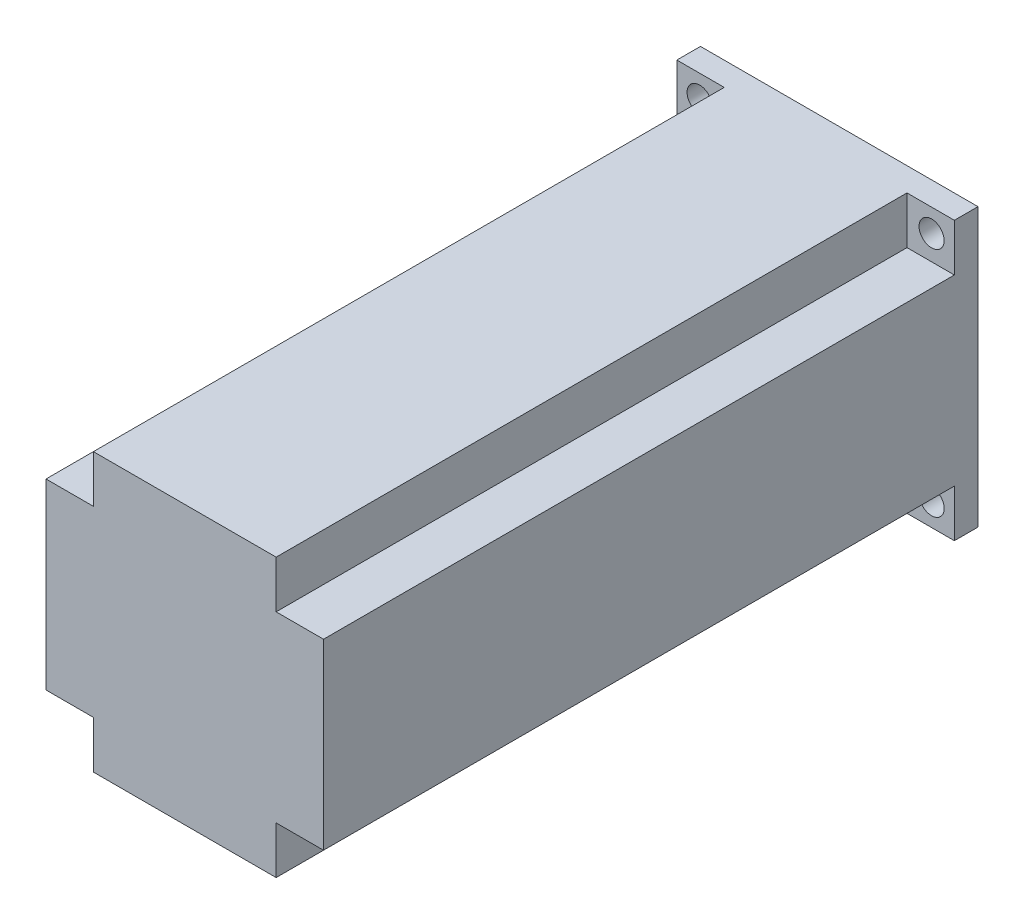
ISO-10303-21;
HEADER;
FILE_DESCRIPTION(('STEP AP214'),'2;1');
FILE_NAME('part.step','',(''),(''),'','','');
FILE_SCHEMA(('AUTOMOTIVE_DESIGN { 1 0 10303 214 1 1 1 1 }'));
ENDSEC;
DATA;
#1=APPLICATION_CONTEXT('core data for automotive mechanical design processes');
#2=APPLICATION_PROTOCOL_DEFINITION('international standard','automotive_design',2000,#1);
#3=PRODUCT_CONTEXT('',#1,'mechanical');
#4=PRODUCT('Part','Part','',(#3));
#5=PRODUCT_RELATED_PRODUCT_CATEGORY('part','',(#4));
#6=PRODUCT_DEFINITION_FORMATION('','',#4);
#7=PRODUCT_DEFINITION_CONTEXT('part definition',#1,'design');
#8=PRODUCT_DEFINITION('design','',#6,#7);
#9=PRODUCT_DEFINITION_SHAPE('','',#8);
#10=(LENGTH_UNIT() NAMED_UNIT(*) SI_UNIT(.MILLI.,.METRE.));
#11=(NAMED_UNIT(*) PLANE_ANGLE_UNIT() SI_UNIT($,.RADIAN.));
#12=(NAMED_UNIT(*) SI_UNIT($,.STERADIAN.) SOLID_ANGLE_UNIT());
#13=UNCERTAINTY_MEASURE_WITH_UNIT(LENGTH_MEASURE(1.E-05),#10,'distance_accuracy_value','');
#14=(GEOMETRIC_REPRESENTATION_CONTEXT(3) GLOBAL_UNCERTAINTY_ASSIGNED_CONTEXT((#13)) GLOBAL_UNIT_ASSIGNED_CONTEXT((#10,
#11,#12)) REPRESENTATION_CONTEXT('',''));
#15=CARTESIAN_POINT('',(0.,0.,0.));
#16=DIRECTION('',(0.,0.,1.));
#17=DIRECTION('',(1.,0.,0.));
#18=AXIS2_PLACEMENT_3D('',#15,#16,#17);
#19=CARTESIAN_POINT('',(0.,0.,133.));
#20=DIRECTION('',(0.,0.,1.));
#21=DIRECTION('',(1.,0.,0.));
#22=AXIS2_PLACEMENT_3D('',#19,#20,#21);
#23=PLANE('',#22);
#24=DIRECTION('',(-1.,0.,0.));
#25=VECTOR('',#24,1.);
#26=CARTESIAN_POINT('',(-28.2,28.2,133.));
#27=LINE('',#26,#25);
#28=CARTESIAN_POINT('',(18.5699999999986,28.2,133.));
#29=VERTEX_POINT('',#28);
#30=CARTESIAN_POINT('',(-18.57,28.2,133.));
#31=VERTEX_POINT('',#30);
#32=EDGE_CURVE('E315',#29,#31,#27,.T.);
#33=ORIENTED_EDGE('',*,*,#32,.T.);
#34=DIRECTION('',(0.,-1.,0.));
#35=VECTOR('',#34,1.);
#36=CARTESIAN_POINT('',(-18.57,28.5699999999986,133.));
#37=LINE('',#36,#35);
#38=CARTESIAN_POINT('',(-18.57,18.5699999999986,133.));
#39=VERTEX_POINT('',#38);
#40=EDGE_CURVE('E247',#31,#39,#37,.T.);
#41=ORIENTED_EDGE('',*,*,#40,.T.);
#42=DIRECTION('',(1.,0.,0.));
#43=VECTOR('',#42,1.);
#44=CARTESIAN_POINT('',(-28.57,18.5699999999986,133.));
#45=LINE('',#44,#43);
#46=CARTESIAN_POINT('',(-28.2,18.5699999999986,133.));
#47=VERTEX_POINT('',#46);
#48=EDGE_CURVE('E218',#47,#39,#45,.T.);
#49=ORIENTED_EDGE('',*,*,#48,.F.);
#50=DIRECTION('',(0.,-1.,0.));
#51=VECTOR('',#50,1.);
#52=CARTESIAN_POINT('',(-28.2,28.2,133.));
#53=LINE('',#52,#51);
#54=CARTESIAN_POINT('',(-28.2,-18.57,133.));
#55=VERTEX_POINT('',#54);
#56=EDGE_CURVE('E319',#47,#55,#53,.T.);
#57=ORIENTED_EDGE('',*,*,#56,.T.);
#58=DIRECTION('',(1.,0.,0.));
#59=VECTOR('',#58,1.);
#60=CARTESIAN_POINT('',(0.,-18.57,133.));
#61=LINE('',#60,#59);
#62=CARTESIAN_POINT('',(-18.5699999999976,-18.57,133.));
#63=VERTEX_POINT('',#62);
#64=EDGE_CURVE('E184',#55,#63,#61,.T.);
#65=ORIENTED_EDGE('',*,*,#64,.T.);
#66=DIRECTION('',(0.,1.,0.));
#67=VECTOR('',#66,1.);
#68=CARTESIAN_POINT('',(-18.5699999999976,0.,133.));
#69=LINE('',#68,#67);
#70=CARTESIAN_POINT('',(-18.5699999999976,-28.2,133.));
#71=VERTEX_POINT('',#70);
#72=EDGE_CURVE('E188',#71,#63,#69,.T.);
#73=ORIENTED_EDGE('',*,*,#72,.F.);
#74=DIRECTION('',(1.,0.,0.));
#75=VECTOR('',#74,1.);
#76=CARTESIAN_POINT('',(-28.2,-28.2,133.));
#77=LINE('',#76,#75);
#78=CARTESIAN_POINT('',(18.570000000001,-28.2,133.));
#79=VERTEX_POINT('',#78);
#80=EDGE_CURVE('E182',#71,#79,#77,.T.);
#81=ORIENTED_EDGE('',*,*,#80,.T.);
#82=DIRECTION('',(0.,1.,0.));
#83=VECTOR('',#82,1.);
#84=CARTESIAN_POINT('',(18.570000000001,0.,133.));
#85=LINE('',#84,#83);
#86=CARTESIAN_POINT('',(18.570000000001,-18.5699999999976,133.));
#87=VERTEX_POINT('',#86);
#88=EDGE_CURVE('E159',#79,#87,#85,.T.);
#89=ORIENTED_EDGE('',*,*,#88,.T.);
#90=DIRECTION('',(-1.,0.,0.));
#91=VECTOR('',#90,1.);
#92=CARTESIAN_POINT('',(0.,-18.5699999999976,133.));
#93=LINE('',#92,#91);
#94=CARTESIAN_POINT('',(28.2,-18.5699999999976,133.));
#95=VERTEX_POINT('',#94);
#96=EDGE_CURVE('E170',#95,#87,#93,.T.);
#97=ORIENTED_EDGE('',*,*,#96,.F.);
#98=DIRECTION('',(0.,1.,0.));
#99=VECTOR('',#98,1.);
#100=CARTESIAN_POINT('',(28.2,28.2,133.));
#101=LINE('',#100,#99);
#102=CARTESIAN_POINT('',(28.2,18.570000000001,133.));
#103=VERTEX_POINT('',#102);
#104=EDGE_CURVE('E312',#95,#103,#101,.T.);
#105=ORIENTED_EDGE('',*,*,#104,.T.);
#106=DIRECTION('',(-1.,0.,0.));
#107=VECTOR('',#106,1.);
#108=CARTESIAN_POINT('',(0.,18.570000000001,133.));
#109=LINE('',#108,#107);
#110=CARTESIAN_POINT('',(18.5699999999986,18.570000000001,133.));
#111=VERTEX_POINT('',#110);
#112=EDGE_CURVE('E167',#103,#111,#109,.T.);
#113=ORIENTED_EDGE('',*,*,#112,.T.);
#114=DIRECTION('',(0.,-1.,0.));
#115=VECTOR('',#114,1.);
#116=CARTESIAN_POINT('',(18.5699999999987,0.,133.));
#117=LINE('',#116,#115);
#118=EDGE_CURVE('E219',#29,#111,#117,.T.);
#119=ORIENTED_EDGE('',*,*,#118,.F.);
#120=EDGE_LOOP('',(#33,#41,#49,#57,#65,#73,#81,#89,#97,#105,#113,#119));
#121=FACE_BOUND('',#120,.T.);
#122=ADVANCED_FACE('F39',(#121),#23,.T.);
#123=CARTESIAN_POINT('',(28.2,28.2,133.));
#124=DIRECTION('',(-1.,0.,0.));
#125=DIRECTION('',(0.,-1.,0.));
#126=AXIS2_PLACEMENT_3D('',#123,#124,#125);
#127=PLANE('',#126);
#128=DIRECTION('',(0.,0.,1.));
#129=VECTOR('',#128,1.);
#130=CARTESIAN_POINT('',(28.2,18.570000000001,4.80000000000003));
#131=LINE('',#130,#129);
#132=CARTESIAN_POINT('',(28.2,18.570000000001,4.80000000000003));
#133=VERTEX_POINT('',#132);
#134=EDGE_CURVE('E207',#133,#103,#131,.T.);
#135=ORIENTED_EDGE('',*,*,#134,.T.);
#136=ORIENTED_EDGE('',*,*,#104,.F.);
#137=DIRECTION('',(0.,0.,1.));
#138=VECTOR('',#137,1.);
#139=CARTESIAN_POINT('',(28.2,-18.5699999999976,4.80000000000003));
#140=LINE('',#139,#138);
#141=CARTESIAN_POINT('',(28.2,-18.5699999999976,4.80000000000003));
#142=VERTEX_POINT('',#141);
#143=EDGE_CURVE('E166',#142,#95,#140,.T.);
#144=ORIENTED_EDGE('',*,*,#143,.F.);
#145=DIRECTION('',(0.,1.,0.));
#146=VECTOR('',#145,1.);
#147=CARTESIAN_POINT('',(28.2,0.,4.80000000000003));
#148=LINE('',#147,#146);
#149=CARTESIAN_POINT('',(28.2,-28.2,4.80000000000003));
#150=VERTEX_POINT('',#149);
#151=EDGE_CURVE('E199',#150,#142,#148,.T.);
#152=ORIENTED_EDGE('',*,*,#151,.F.);
#153=DIRECTION('',(0.,0.,-1.));
#154=VECTOR('',#153,1.);
#155=CARTESIAN_POINT('',(28.2,-28.2,133.));
#156=LINE('',#155,#154);
#157=CARTESIAN_POINT('',(28.2,-28.2,0.));
#158=VERTEX_POINT('',#157);
#159=EDGE_CURVE('E325',#150,#158,#156,.T.);
#160=ORIENTED_EDGE('',*,*,#159,.T.);
#161=DIRECTION('',(0.,1.,0.));
#162=VECTOR('',#161,1.);
#163=CARTESIAN_POINT('',(28.2,28.2,0.));
#164=LINE('',#163,#162);
#165=CARTESIAN_POINT('',(28.2,28.2,0.));
#166=VERTEX_POINT('',#165);
#167=EDGE_CURVE('E311',#158,#166,#164,.T.);
#168=ORIENTED_EDGE('',*,*,#167,.T.);
#169=DIRECTION('',(0.,0.,-1.));
#170=VECTOR('',#169,1.);
#171=CARTESIAN_POINT('',(28.2,28.2,133.));
#172=LINE('',#171,#170);
#173=CARTESIAN_POINT('',(28.2,28.2,4.80000000000003));
#174=VERTEX_POINT('',#173);
#175=EDGE_CURVE('E348',#174,#166,#172,.T.);
#176=ORIENTED_EDGE('',*,*,#175,.F.);
#177=DIRECTION('',(0.,1.,0.));
#178=VECTOR('',#177,1.);
#179=CARTESIAN_POINT('',(28.2,0.,4.80000000000003));
#180=LINE('',#179,#178);
#181=EDGE_CURVE('E55',#133,#174,#180,.T.);
#182=ORIENTED_EDGE('',*,*,#181,.F.);
#183=EDGE_LOOP('',(#135,#136,#144,#152,#160,#168,#176,#182));
#184=FACE_BOUND('',#183,.T.);
#185=ADVANCED_FACE('F41',(#184),#127,.F.);
#186=CARTESIAN_POINT('',(-28.2,28.2,133.));
#187=DIRECTION('',(0.,-1.,0.));
#188=DIRECTION('',(0.,0.,-1.));
#189=AXIS2_PLACEMENT_3D('',#186,#187,#188);
#190=PLANE('',#189);
#191=DIRECTION('',(0.,0.,-1.));
#192=VECTOR('',#191,1.);
#193=CARTESIAN_POINT('',(-18.57,28.2,133.));
#194=LINE('',#193,#192);
#195=CARTESIAN_POINT('',(-18.57,28.2,4.80000000000003));
#196=VERTEX_POINT('',#195);
#197=EDGE_CURVE('E48',#31,#196,#194,.T.);
#198=ORIENTED_EDGE('',*,*,#197,.F.);
#199=ORIENTED_EDGE('',*,*,#32,.F.);
#200=DIRECTION('',(0.,0.,1.));
#201=VECTOR('',#200,1.);
#202=CARTESIAN_POINT('',(18.5699999999986,28.2,4.80000000000003));
#203=LINE('',#202,#201);
#204=CARTESIAN_POINT('',(18.5699999999986,28.2,4.80000000000003));
#205=VERTEX_POINT('',#204);
#206=EDGE_CURVE('E212',#205,#29,#203,.T.);
#207=ORIENTED_EDGE('',*,*,#206,.F.);
#208=DIRECTION('',(-1.,0.,0.));
#209=VECTOR('',#208,1.);
#210=CARTESIAN_POINT('',(0.,28.2,4.80000000000003));
#211=LINE('',#210,#209);
#212=EDGE_CURVE('E234',#174,#205,#211,.T.);
#213=ORIENTED_EDGE('',*,*,#212,.F.);
#214=ORIENTED_EDGE('',*,*,#175,.T.);
#215=DIRECTION('',(-1.,0.,0.));
#216=VECTOR('',#215,1.);
#217=CARTESIAN_POINT('',(-28.2,28.2,0.));
#218=LINE('',#217,#216);
#219=CARTESIAN_POINT('',(-28.2,28.2,0.));
#220=VERTEX_POINT('',#219);
#221=EDGE_CURVE('E329',#166,#220,#218,.T.);
#222=ORIENTED_EDGE('',*,*,#221,.T.);
#223=DIRECTION('',(0.,0.,-1.));
#224=VECTOR('',#223,1.);
#225=CARTESIAN_POINT('',(-28.2,28.2,133.));
#226=LINE('',#225,#224);
#227=CARTESIAN_POINT('',(-28.2,28.2,4.80000000000003));
#228=VERTEX_POINT('',#227);
#229=EDGE_CURVE('E345',#228,#220,#226,.T.);
#230=ORIENTED_EDGE('',*,*,#229,.F.);
#231=DIRECTION('',(-1.,0.,0.));
#232=VECTOR('',#231,1.);
#233=CARTESIAN_POINT('',(-28.2,28.2,4.80000000000003));
#234=LINE('',#233,#232);
#235=EDGE_CURVE('E63',#196,#228,#234,.T.);
#236=ORIENTED_EDGE('',*,*,#235,.F.);
#237=EDGE_LOOP('',(#198,#199,#207,#213,#214,#222,#230,#236));
#238=FACE_BOUND('',#237,.T.);
#239=ADVANCED_FACE('F398',(#238),#190,.F.);
#240=CARTESIAN_POINT('',(-28.2,28.2,133.));
#241=DIRECTION('',(1.,0.,0.));
#242=DIRECTION('',(0.,1.,0.));
#243=AXIS2_PLACEMENT_3D('',#240,#241,#242);
#244=PLANE('',#243);
#245=ORIENTED_EDGE('',*,*,#56,.F.);
#246=DIRECTION('',(0.,0.,-1.));
#247=VECTOR('',#246,1.);
#248=CARTESIAN_POINT('',(-28.2,18.5699999999986,133.));
#249=LINE('',#248,#247);
#250=CARTESIAN_POINT('',(-28.2,18.5699999999986,4.80000000000003));
#251=VERTEX_POINT('',#250);
#252=EDGE_CURVE('E351',#47,#251,#249,.T.);
#253=ORIENTED_EDGE('',*,*,#252,.T.);
#254=DIRECTION('',(0.,-1.,0.));
#255=VECTOR('',#254,1.);
#256=CARTESIAN_POINT('',(-28.2,28.2,4.80000000000003));
#257=LINE('',#256,#255);
#258=EDGE_CURVE('E290',#228,#251,#257,.T.);
#259=ORIENTED_EDGE('',*,*,#258,.F.);
#260=ORIENTED_EDGE('',*,*,#229,.T.);
#261=DIRECTION('',(0.,-1.,0.));
#262=VECTOR('',#261,1.);
#263=CARTESIAN_POINT('',(-28.2,28.2,0.));
#264=LINE('',#263,#262);
#265=CARTESIAN_POINT('',(-28.2,-28.2,0.));
#266=VERTEX_POINT('',#265);
#267=EDGE_CURVE('E333',#220,#266,#264,.T.);
#268=ORIENTED_EDGE('',*,*,#267,.T.);
#269=DIRECTION('',(0.,0.,-1.));
#270=VECTOR('',#269,1.);
#271=CARTESIAN_POINT('',(-28.2,-28.2,133.));
#272=LINE('',#271,#270);
#273=CARTESIAN_POINT('',(-28.2,-28.2,4.80000000000003));
#274=VERTEX_POINT('',#273);
#275=EDGE_CURVE('E342',#274,#266,#272,.T.);
#276=ORIENTED_EDGE('',*,*,#275,.F.);
#277=DIRECTION('',(0.,-1.,0.));
#278=VECTOR('',#277,1.);
#279=CARTESIAN_POINT('',(-28.2,0.,4.80000000000003));
#280=LINE('',#279,#278);
#281=CARTESIAN_POINT('',(-28.2,-18.57,4.80000000000003));
#282=VERTEX_POINT('',#281);
#283=EDGE_CURVE('E262',#282,#274,#280,.T.);
#284=ORIENTED_EDGE('',*,*,#283,.F.);
#285=DIRECTION('',(0.,0.,1.));
#286=VECTOR('',#285,1.);
#287=CARTESIAN_POINT('',(-28.2,-18.57,4.80000000000003));
#288=LINE('',#287,#286);
#289=EDGE_CURVE('E275',#282,#55,#288,.T.);
#290=ORIENTED_EDGE('',*,*,#289,.T.);
#291=EDGE_LOOP('',(#245,#253,#259,#260,#268,#276,#284,#290));
#292=FACE_BOUND('',#291,.T.);
#293=ADVANCED_FACE('F409',(#292),#244,.F.);
#294=CARTESIAN_POINT('',(-28.2,-28.2,133.));
#295=DIRECTION('',(0.,1.,0.));
#296=DIRECTION('',(0.,0.,1.));
#297=AXIS2_PLACEMENT_3D('',#294,#295,#296);
#298=PLANE('',#297);
#299=DIRECTION('',(0.,0.,1.));
#300=VECTOR('',#299,1.);
#301=CARTESIAN_POINT('',(18.570000000001,-28.2,4.80000000000003));
#302=LINE('',#301,#300);
#303=CARTESIAN_POINT('',(18.570000000001,-28.2,4.80000000000003));
#304=VERTEX_POINT('',#303);
#305=EDGE_CURVE('E196',#304,#79,#302,.T.);
#306=ORIENTED_EDGE('',*,*,#305,.T.);
#307=ORIENTED_EDGE('',*,*,#80,.F.);
#308=DIRECTION('',(0.,0.,1.));
#309=VECTOR('',#308,1.);
#310=CARTESIAN_POINT('',(-18.5699999999976,-28.2,4.80000000000003));
#311=LINE('',#310,#309);
#312=CARTESIAN_POINT('',(-18.5699999999976,-28.2,4.80000000000003));
#313=VERTEX_POINT('',#312);
#314=EDGE_CURVE('E284',#313,#71,#311,.T.);
#315=ORIENTED_EDGE('',*,*,#314,.F.);
#316=DIRECTION('',(1.,0.,0.));
#317=VECTOR('',#316,1.);
#318=CARTESIAN_POINT('',(0.,-28.2,4.80000000000003));
#319=LINE('',#318,#317);
#320=EDGE_CURVE('E265',#274,#313,#319,.T.);
#321=ORIENTED_EDGE('',*,*,#320,.F.);
#322=ORIENTED_EDGE('',*,*,#275,.T.);
#323=DIRECTION('',(1.,0.,0.));
#324=VECTOR('',#323,1.);
#325=CARTESIAN_POINT('',(-28.2,-28.2,0.));
#326=LINE('',#325,#324);
#327=EDGE_CURVE('E316',#266,#158,#326,.T.);
#328=ORIENTED_EDGE('',*,*,#327,.T.);
#329=ORIENTED_EDGE('',*,*,#159,.F.);
#330=DIRECTION('',(1.,0.,0.));
#331=VECTOR('',#330,1.);
#332=CARTESIAN_POINT('',(0.,-28.2,4.80000000000003));
#333=LINE('',#332,#331);
#334=EDGE_CURVE('E202',#304,#150,#333,.T.);
#335=ORIENTED_EDGE('',*,*,#334,.F.);
#336=EDGE_LOOP('',(#306,#307,#315,#321,#322,#328,#329,#335));
#337=FACE_BOUND('',#336,.T.);
#338=ADVANCED_FACE('F379',(#337),#298,.F.);
#339=CARTESIAN_POINT('',(23.57,23.57,133.));
#340=DIRECTION('',(0.,0.,-1.));
#341=DIRECTION('',(-1.,0.,0.));
#342=AXIS2_PLACEMENT_3D('',#339,#340,#341);
#343=CYLINDRICAL_SURFACE('',#342,2.55);
#344=CARTESIAN_POINT('',(23.57,23.57,0.));
#345=DIRECTION('',(0.,0.,1.));
#346=DIRECTION('',(1.,0.,0.));
#347=AXIS2_PLACEMENT_3D('',#344,#345,#346);
#348=CIRCLE('',#347,2.55);
#349=CARTESIAN_POINT('',(26.12,23.57,0.));
#350=VERTEX_POINT('',#349);
#351=EDGE_CURVE('E307',#350,#350,#348,.T.);
#352=ORIENTED_EDGE('',*,*,#351,.F.);
#353=EDGE_LOOP('',(#352));
#354=FACE_BOUND('',#353,.T.);
#355=CARTESIAN_POINT('',(23.57,23.57,4.80000000000003));
#356=DIRECTION('',(0.,0.,1.));
#357=DIRECTION('',(1.,0.,0.));
#358=AXIS2_PLACEMENT_3D('',#355,#356,#357);
#359=CIRCLE('',#358,2.55);
#360=CARTESIAN_POINT('',(26.12,23.57,4.80000000000003));
#361=VERTEX_POINT('',#360);
#362=EDGE_CURVE('E211',#361,#361,#359,.F.);
#363=ORIENTED_EDGE('',*,*,#362,.F.);
#364=EDGE_LOOP('',(#363));
#365=FACE_BOUND('',#364,.T.);
#366=ADVANCED_FACE('F464',(#354,#365),#343,.F.);
#367=CARTESIAN_POINT('',(23.5700000000014,-23.57,133.));
#368=DIRECTION('',(0.,0.,-1.));
#369=DIRECTION('',(-1.,0.,0.));
#370=AXIS2_PLACEMENT_3D('',#367,#368,#369);
#371=CYLINDRICAL_SURFACE('',#370,2.54999999999967);
#372=CARTESIAN_POINT('',(23.5700000000014,-23.57,0.));
#373=DIRECTION('',(0.,0.,1.));
#374=DIRECTION('',(1.,0.,0.));
#375=AXIS2_PLACEMENT_3D('',#372,#373,#374);
#376=CIRCLE('',#375,2.54999999999967);
#377=CARTESIAN_POINT('',(26.120000000001,-23.57,0.));
#378=VERTEX_POINT('',#377);
#379=EDGE_CURVE('E303',#378,#378,#376,.T.);
#380=ORIENTED_EDGE('',*,*,#379,.F.);
#381=EDGE_LOOP('',(#380));
#382=FACE_BOUND('',#381,.T.);
#383=CARTESIAN_POINT('',(23.5700000000014,-23.57,4.80000000000003));
#384=DIRECTION('',(0.,0.,1.));
#385=DIRECTION('',(1.,0.,0.));
#386=AXIS2_PLACEMENT_3D('',#383,#384,#385);
#387=CIRCLE('',#386,2.54999999999967);
#388=CARTESIAN_POINT('',(26.120000000001,-23.57,4.80000000000003));
#389=VERTEX_POINT('',#388);
#390=EDGE_CURVE('E191',#389,#389,#387,.F.);
#391=ORIENTED_EDGE('',*,*,#390,.F.);
#392=EDGE_LOOP('',(#391));
#393=FACE_BOUND('',#392,.T.);
#394=ADVANCED_FACE('F489',(#382,#393),#371,.F.);
#395=CARTESIAN_POINT('',(-23.5699999999986,-23.5700000000013,133.));
#396=DIRECTION('',(0.,0.,-1.));
#397=DIRECTION('',(-1.,0.,0.));
#398=AXIS2_PLACEMENT_3D('',#395,#396,#397);
#399=CYLINDRICAL_SURFACE('',#398,2.55000000000102);
#400=CARTESIAN_POINT('',(-23.5699999999986,-23.5700000000013,0.));
#401=DIRECTION('',(0.,0.,1.));
#402=DIRECTION('',(1.,0.,0.));
#403=AXIS2_PLACEMENT_3D('',#400,#401,#402);
#404=CIRCLE('',#403,2.55000000000102);
#405=CARTESIAN_POINT('',(-21.0199999999976,-23.5700000000013,0.));
#406=VERTEX_POINT('',#405);
#407=EDGE_CURVE('E299',#406,#406,#404,.T.);
#408=ORIENTED_EDGE('',*,*,#407,.F.);
#409=EDGE_LOOP('',(#408));
#410=FACE_BOUND('',#409,.T.);
#411=CARTESIAN_POINT('',(-23.5699999999986,-23.5700000000013,4.80000000000003));
#412=DIRECTION('',(0.,0.,1.));
#413=DIRECTION('',(1.,0.,0.));
#414=AXIS2_PLACEMENT_3D('',#411,#412,#413);
#415=CIRCLE('',#414,2.55000000000102);
#416=CARTESIAN_POINT('',(-21.0199999999976,-23.5700000000013,4.80000000000003));
#417=VERTEX_POINT('',#416);
#418=EDGE_CURVE('E272',#417,#417,#415,.F.);
#419=ORIENTED_EDGE('',*,*,#418,.F.);
#420=EDGE_LOOP('',(#419));
#421=FACE_BOUND('',#420,.T.);
#422=ADVANCED_FACE('F443',(#410,#421),#399,.F.);
#423=CARTESIAN_POINT('',(-23.57,23.5699999999986,133.));
#424=DIRECTION('',(0.,0.,-1.));
#425=DIRECTION('',(-1.,0.,0.));
#426=AXIS2_PLACEMENT_3D('',#423,#424,#425);
#427=CYLINDRICAL_SURFACE('',#426,2.55000000000145);
#428=CARTESIAN_POINT('',(-23.57,23.5699999999986,0.));
#429=DIRECTION('',(0.,0.,1.));
#430=DIRECTION('',(1.,0.,0.));
#431=AXIS2_PLACEMENT_3D('',#428,#429,#430);
#432=CIRCLE('',#431,2.55000000000145);
#433=CARTESIAN_POINT('',(-21.0199999999986,23.5699999999986,0.));
#434=VERTEX_POINT('',#433);
#435=EDGE_CURVE('E295',#434,#434,#432,.T.);
#436=ORIENTED_EDGE('',*,*,#435,.F.);
#437=EDGE_LOOP('',(#436));
#438=FACE_BOUND('',#437,.T.);
#439=CARTESIAN_POINT('',(-23.57,23.5699999999986,4.80000000000003));
#440=DIRECTION('',(0.,0.,1.));
#441=DIRECTION('',(1.,0.,0.));
#442=AXIS2_PLACEMENT_3D('',#439,#440,#441);
#443=CIRCLE('',#442,2.55000000000145);
#444=CARTESIAN_POINT('',(-21.0199999999986,23.5699999999986,4.80000000000003));
#445=VERTEX_POINT('',#444);
#446=EDGE_CURVE('E283',#445,#445,#443,.T.);
#447=ORIENTED_EDGE('',*,*,#446,.T.);
#448=EDGE_LOOP('',(#447));
#449=FACE_BOUND('',#448,.T.);
#450=ADVANCED_FACE('F430',(#438,#449),#427,.F.);
#451=CARTESIAN_POINT('',(0.,0.,0.));
#452=DIRECTION('',(0.,0.,1.));
#453=DIRECTION('',(1.,0.,0.));
#454=AXIS2_PLACEMENT_3D('',#451,#452,#453);
#455=PLANE('',#454);
#456=CARTESIAN_POINT('',(0.,0.,0.));
#457=DIRECTION('',(0.,0.,1.));
#458=DIRECTION('',(1.,0.,0.));
#459=AXIS2_PLACEMENT_3D('',#456,#457,#458);
#460=CIRCLE('',#459,19.05);
#461=CARTESIAN_POINT('',(19.05,0.,0.));
#462=VERTEX_POINT('',#461);
#463=EDGE_CURVE('E11',#462,#462,#460,.F.);
#464=ORIENTED_EDGE('',*,*,#463,.F.);
#465=EDGE_LOOP('',(#464));
#466=FACE_BOUND('',#465,.T.);
#467=ORIENTED_EDGE('',*,*,#167,.F.);
#468=ORIENTED_EDGE('',*,*,#327,.F.);
#469=ORIENTED_EDGE('',*,*,#267,.F.);
#470=ORIENTED_EDGE('',*,*,#221,.F.);
#471=EDGE_LOOP('',(#467,#468,#469,#470));
#472=FACE_BOUND('',#471,.T.);
#473=ORIENTED_EDGE('',*,*,#351,.T.);
#474=EDGE_LOOP('',(#473));
#475=FACE_BOUND('',#474,.T.);
#476=ORIENTED_EDGE('',*,*,#379,.T.);
#477=EDGE_LOOP('',(#476));
#478=FACE_BOUND('',#477,.T.);
#479=ORIENTED_EDGE('',*,*,#407,.T.);
#480=EDGE_LOOP('',(#479));
#481=FACE_BOUND('',#480,.T.);
#482=ORIENTED_EDGE('',*,*,#435,.T.);
#483=EDGE_LOOP('',(#482));
#484=FACE_BOUND('',#483,.T.);
#485=ADVANCED_FACE('F427',(#466,#472,#475,#478,#481,#484),#455,.F.);
#486=CARTESIAN_POINT('',(-18.57,28.5699999999986,4.80000000000003));
#487=DIRECTION('',(-1.,0.,0.));
#488=DIRECTION('',(0.,0.,1.));
#489=AXIS2_PLACEMENT_3D('',#486,#487,#488);
#490=PLANE('',#489);
#491=ORIENTED_EDGE('',*,*,#197,.T.);
#492=DIRECTION('',(0.,-1.,0.));
#493=VECTOR('',#492,1.);
#494=CARTESIAN_POINT('',(-18.57,28.5699999999986,4.80000000000003));
#495=LINE('',#494,#493);
#496=CARTESIAN_POINT('',(-18.57,18.5699999999986,4.80000000000003));
#497=VERTEX_POINT('',#496);
#498=EDGE_CURVE('E245',#196,#497,#495,.T.);
#499=ORIENTED_EDGE('',*,*,#498,.T.);
#500=DIRECTION('',(0.,0.,1.));
#501=VECTOR('',#500,1.);
#502=CARTESIAN_POINT('',(-18.57,18.5699999999986,4.80000000000003));
#503=LINE('',#502,#501);
#504=EDGE_CURVE('E241',#497,#39,#503,.T.);
#505=ORIENTED_EDGE('',*,*,#504,.T.);
#506=ORIENTED_EDGE('',*,*,#40,.F.);
#507=EDGE_LOOP('',(#491,#499,#505,#506));
#508=FACE_BOUND('',#507,.T.);
#509=ADVANCED_FACE('F403',(#508),#490,.T.);
#510=CARTESIAN_POINT('',(-28.57,18.5699999999986,4.80000000000003));
#511=DIRECTION('',(0.,-1.,0.));
#512=DIRECTION('',(0.,0.,-1.));
#513=AXIS2_PLACEMENT_3D('',#510,#511,#512);
#514=PLANE('',#513);
#515=ORIENTED_EDGE('',*,*,#48,.T.);
#516=ORIENTED_EDGE('',*,*,#504,.F.);
#517=DIRECTION('',(1.,0.,0.));
#518=VECTOR('',#517,1.);
#519=CARTESIAN_POINT('',(-28.57,18.5699999999986,4.80000000000003));
#520=LINE('',#519,#518);
#521=EDGE_CURVE('E251',#251,#497,#520,.T.);
#522=ORIENTED_EDGE('',*,*,#521,.F.);
#523=ORIENTED_EDGE('',*,*,#252,.F.);
#524=EDGE_LOOP('',(#515,#516,#522,#523));
#525=FACE_BOUND('',#524,.T.);
#526=ADVANCED_FACE('F407',(#525),#514,.F.);
#527=CARTESIAN_POINT('',(0.,0.,4.80000000000003));
#528=DIRECTION('',(0.,0.,1.));
#529=DIRECTION('',(1.,0.,0.));
#530=AXIS2_PLACEMENT_3D('',#527,#528,#529);
#531=PLANE('',#530);
#532=ORIENTED_EDGE('',*,*,#446,.F.);
#533=EDGE_LOOP('',(#532));
#534=FACE_BOUND('',#533,.T.);
#535=ORIENTED_EDGE('',*,*,#235,.T.);
#536=ORIENTED_EDGE('',*,*,#258,.T.);
#537=ORIENTED_EDGE('',*,*,#521,.T.);
#538=ORIENTED_EDGE('',*,*,#498,.F.);
#539=EDGE_LOOP('',(#535,#536,#537,#538));
#540=FACE_BOUND('',#539,.T.);
#541=ADVANCED_FACE('F447',(#534,#540),#531,.T.);
#542=CARTESIAN_POINT('',(0.,-18.57,4.80000000000003));
#543=DIRECTION('',(0.,-1.,0.));
#544=DIRECTION('',(1.,0.,0.));
#545=AXIS2_PLACEMENT_3D('',#542,#543,#544);
#546=PLANE('',#545);
#547=ORIENTED_EDGE('',*,*,#64,.F.);
#548=ORIENTED_EDGE('',*,*,#289,.F.);
#549=DIRECTION('',(1.,0.,0.));
#550=VECTOR('',#549,1.);
#551=CARTESIAN_POINT('',(0.,-18.57,4.80000000000003));
#552=LINE('',#551,#550);
#553=CARTESIAN_POINT('',(-18.5699999999976,-18.57,4.80000000000003));
#554=VERTEX_POINT('',#553);
#555=EDGE_CURVE('E259',#282,#554,#552,.T.);
#556=ORIENTED_EDGE('',*,*,#555,.T.);
#557=DIRECTION('',(0.,0.,1.));
#558=VECTOR('',#557,1.);
#559=CARTESIAN_POINT('',(-18.5699999999976,-18.57,4.80000000000003));
#560=LINE('',#559,#558);
#561=EDGE_CURVE('E280',#554,#63,#560,.T.);
#562=ORIENTED_EDGE('',*,*,#561,.T.);
#563=EDGE_LOOP('',(#547,#548,#556,#562));
#564=FACE_BOUND('',#563,.T.);
#565=ADVANCED_FACE('F413',(#564),#546,.T.);
#566=CARTESIAN_POINT('',(-18.5699999999976,0.,4.80000000000003));
#567=DIRECTION('',(1.,0.,0.));
#568=DIRECTION('',(0.,1.,0.));
#569=AXIS2_PLACEMENT_3D('',#566,#567,#568);
#570=PLANE('',#569);
#571=ORIENTED_EDGE('',*,*,#72,.T.);
#572=ORIENTED_EDGE('',*,*,#561,.F.);
#573=DIRECTION('',(0.,1.,0.));
#574=VECTOR('',#573,1.);
#575=CARTESIAN_POINT('',(-18.5699999999976,0.,4.80000000000003));
#576=LINE('',#575,#574);
#577=EDGE_CURVE('E268',#313,#554,#576,.T.);
#578=ORIENTED_EDGE('',*,*,#577,.F.);
#579=ORIENTED_EDGE('',*,*,#314,.T.);
#580=EDGE_LOOP('',(#571,#572,#578,#579));
#581=FACE_BOUND('',#580,.T.);
#582=ADVANCED_FACE('F418',(#581),#570,.F.);
#583=CARTESIAN_POINT('',(0.,0.,4.80000000000003));
#584=DIRECTION('',(0.,0.,1.));
#585=DIRECTION('',(1.,0.,0.));
#586=AXIS2_PLACEMENT_3D('',#583,#584,#585);
#587=PLANE('',#586);
#588=ORIENTED_EDGE('',*,*,#555,.F.);
#589=ORIENTED_EDGE('',*,*,#283,.T.);
#590=ORIENTED_EDGE('',*,*,#320,.T.);
#591=ORIENTED_EDGE('',*,*,#577,.T.);
#592=EDGE_LOOP('',(#588,#589,#590,#591));
#593=FACE_BOUND('',#592,.T.);
#594=ORIENTED_EDGE('',*,*,#418,.T.);
#595=EDGE_LOOP('',(#594));
#596=FACE_BOUND('',#595,.T.);
#597=ADVANCED_FACE('F541',(#593,#596),#587,.T.);
#598=CARTESIAN_POINT('',(18.570000000001,0.,4.80000000000003));
#599=DIRECTION('',(1.,0.,0.));
#600=DIRECTION('',(0.,0.,-1.));
#601=AXIS2_PLACEMENT_3D('',#598,#599,#600);
#602=PLANE('',#601);
#603=ORIENTED_EDGE('',*,*,#88,.F.);
#604=ORIENTED_EDGE('',*,*,#305,.F.);
#605=DIRECTION('',(0.,1.,0.));
#606=VECTOR('',#605,1.);
#607=CARTESIAN_POINT('',(18.570000000001,0.,4.80000000000003));
#608=LINE('',#607,#606);
#609=CARTESIAN_POINT('',(18.570000000001,-18.5699999999976,4.80000000000003));
#610=VERTEX_POINT('',#609);
#611=EDGE_CURVE('E161',#304,#610,#608,.T.);
#612=ORIENTED_EDGE('',*,*,#611,.T.);
#613=DIRECTION('',(0.,0.,1.));
#614=VECTOR('',#613,1.);
#615=CARTESIAN_POINT('',(18.570000000001,-18.5699999999976,4.80000000000003));
#616=LINE('',#615,#614);
#617=EDGE_CURVE('E154',#610,#87,#616,.T.);
#618=ORIENTED_EDGE('',*,*,#617,.T.);
#619=EDGE_LOOP('',(#603,#604,#612,#618));
#620=FACE_BOUND('',#619,.T.);
#621=ADVANCED_FACE('F156',(#620),#602,.T.);
#622=CARTESIAN_POINT('',(0.,-18.5699999999976,4.80000000000003));
#623=DIRECTION('',(0.,1.,0.));
#624=DIRECTION('',(0.,0.,1.));
#625=AXIS2_PLACEMENT_3D('',#622,#623,#624);
#626=PLANE('',#625);
#627=ORIENTED_EDGE('',*,*,#96,.T.);
#628=ORIENTED_EDGE('',*,*,#617,.F.);
#629=DIRECTION('',(-1.,0.,0.));
#630=VECTOR('',#629,1.);
#631=CARTESIAN_POINT('',(0.,-18.5699999999976,4.80000000000003));
#632=LINE('',#631,#630);
#633=EDGE_CURVE('E195',#142,#610,#632,.T.);
#634=ORIENTED_EDGE('',*,*,#633,.F.);
#635=ORIENTED_EDGE('',*,*,#143,.T.);
#636=EDGE_LOOP('',(#627,#628,#634,#635));
#637=FACE_BOUND('',#636,.T.);
#638=ADVANCED_FACE('F171',(#637),#626,.F.);
#639=CARTESIAN_POINT('',(0.,0.,4.80000000000003));
#640=DIRECTION('',(0.,0.,1.));
#641=DIRECTION('',(1.,0.,0.));
#642=AXIS2_PLACEMENT_3D('',#639,#640,#641);
#643=PLANE('',#642);
#644=ORIENTED_EDGE('',*,*,#611,.F.);
#645=ORIENTED_EDGE('',*,*,#334,.T.);
#646=ORIENTED_EDGE('',*,*,#151,.T.);
#647=ORIENTED_EDGE('',*,*,#633,.T.);
#648=EDGE_LOOP('',(#644,#645,#646,#647));
#649=FACE_BOUND('',#648,.T.);
#650=ORIENTED_EDGE('',*,*,#390,.T.);
#651=EDGE_LOOP('',(#650));
#652=FACE_BOUND('',#651,.T.);
#653=ADVANCED_FACE('F384',(#649,#652),#643,.T.);
#654=CARTESIAN_POINT('',(0.,18.570000000001,4.80000000000003));
#655=DIRECTION('',(0.,1.,0.));
#656=DIRECTION('',(-1.,0.,0.));
#657=AXIS2_PLACEMENT_3D('',#654,#655,#656);
#658=PLANE('',#657);
#659=ORIENTED_EDGE('',*,*,#112,.F.);
#660=ORIENTED_EDGE('',*,*,#134,.F.);
#661=DIRECTION('',(-1.,0.,0.));
#662=VECTOR('',#661,1.);
#663=CARTESIAN_POINT('',(0.,18.570000000001,4.80000000000003));
#664=LINE('',#663,#662);
#665=CARTESIAN_POINT('',(18.5699999999986,18.570000000001,4.80000000000003));
#666=VERTEX_POINT('',#665);
#667=EDGE_CURVE('E223',#133,#666,#664,.T.);
#668=ORIENTED_EDGE('',*,*,#667,.T.);
#669=DIRECTION('',(0.,0.,1.));
#670=VECTOR('',#669,1.);
#671=CARTESIAN_POINT('',(18.5699999999986,18.570000000001,4.80000000000003));
#672=LINE('',#671,#670);
#673=EDGE_CURVE('E215',#666,#111,#672,.T.);
#674=ORIENTED_EDGE('',*,*,#673,.T.);
#675=EDGE_LOOP('',(#659,#660,#668,#674));
#676=FACE_BOUND('',#675,.T.);
#677=ADVANCED_FACE('F390',(#676),#658,.T.);
#678=CARTESIAN_POINT('',(18.5699999999987,0.,4.80000000000003));
#679=DIRECTION('',(-1.,0.,0.));
#680=DIRECTION('',(0.,-1.,0.));
#681=AXIS2_PLACEMENT_3D('',#678,#679,#680);
#682=PLANE('',#681);
#683=ORIENTED_EDGE('',*,*,#118,.T.);
#684=ORIENTED_EDGE('',*,*,#673,.F.);
#685=DIRECTION('',(0.,-1.,0.));
#686=VECTOR('',#685,1.);
#687=CARTESIAN_POINT('',(18.5699999999987,0.,4.80000000000003));
#688=LINE('',#687,#686);
#689=EDGE_CURVE('E230',#205,#666,#688,.T.);
#690=ORIENTED_EDGE('',*,*,#689,.F.);
#691=ORIENTED_EDGE('',*,*,#206,.T.);
#692=EDGE_LOOP('',(#683,#684,#690,#691));
#693=FACE_BOUND('',#692,.T.);
#694=ADVANCED_FACE('F394',(#693),#682,.F.);
#695=CARTESIAN_POINT('',(0.,0.,4.80000000000003));
#696=DIRECTION('',(0.,0.,1.));
#697=DIRECTION('',(1.,0.,0.));
#698=AXIS2_PLACEMENT_3D('',#695,#696,#697);
#699=PLANE('',#698);
#700=ORIENTED_EDGE('',*,*,#667,.F.);
#701=ORIENTED_EDGE('',*,*,#181,.T.);
#702=ORIENTED_EDGE('',*,*,#212,.T.);
#703=ORIENTED_EDGE('',*,*,#689,.T.);
#704=EDGE_LOOP('',(#700,#701,#702,#703));
#705=FACE_BOUND('',#704,.T.);
#706=ORIENTED_EDGE('',*,*,#362,.T.);
#707=EDGE_LOOP('',(#706));
#708=FACE_BOUND('',#707,.T.);
#709=ADVANCED_FACE('F589',(#705,#708),#699,.T.);
#710=CARTESIAN_POINT('',(0.,0.,-1.6));
#711=DIRECTION('',(0.,0.,1.));
#712=DIRECTION('',(1.,0.,0.));
#713=AXIS2_PLACEMENT_3D('',#710,#711,#712);
#714=CYLINDRICAL_SURFACE('',#713,19.05);
#715=CARTESIAN_POINT('',(0.,0.,-1.6));
#716=DIRECTION('',(0.,0.,-1.));
#717=DIRECTION('',(-1.,0.,0.));
#718=AXIS2_PLACEMENT_3D('',#715,#716,#717);
#719=CIRCLE('',#718,19.05);
#720=CARTESIAN_POINT('',(-19.05,0.,-1.6));
#721=VERTEX_POINT('',#720);
#722=EDGE_CURVE('E362',#721,#721,#719,.T.);
#723=ORIENTED_EDGE('',*,*,#722,.F.);
#724=EDGE_LOOP('',(#723));
#725=FACE_BOUND('',#724,.T.);
#726=ORIENTED_EDGE('',*,*,#463,.T.);
#727=EDGE_LOOP('',(#726));
#728=FACE_BOUND('',#727,.T.);
#729=ADVANCED_FACE('F597',(#725,#728),#714,.T.);
#730=CARTESIAN_POINT('',(0.,0.,-1.6));
#731=DIRECTION('',(0.,0.,-1.));
#732=DIRECTION('',(-1.,0.,0.));
#733=AXIS2_PLACEMENT_3D('',#730,#731,#732);
#734=PLANE('',#733);
#735=CARTESIAN_POINT('',(0.,0.,-1.6));
#736=DIRECTION('',(0.,0.,-1.));
#737=DIRECTION('',(-1.,0.,0.));
#738=AXIS2_PLACEMENT_3D('',#735,#736,#737);
#739=CIRCLE('',#738,4.);
#740=CARTESIAN_POINT('',(4.,0.,-1.6));
#741=VERTEX_POINT('',#740);
#742=EDGE_CURVE('E359',#741,#741,#739,.T.);
#743=ORIENTED_EDGE('',*,*,#742,.F.);
#744=EDGE_LOOP('',(#743));
#745=FACE_BOUND('',#744,.T.);
#746=ORIENTED_EDGE('',*,*,#722,.T.);
#747=EDGE_LOOP('',(#746));
#748=FACE_BOUND('',#747,.T.);
#749=ADVANCED_FACE('F609',(#745,#748),#734,.T.);
#750=CARTESIAN_POINT('',(0.,0.,-20.6));
#751=DIRECTION('',(0.,0.,-1.));
#752=DIRECTION('',(-1.,0.,0.));
#753=AXIS2_PLACEMENT_3D('',#750,#751,#752);
#754=PLANE('',#753);
#755=CARTESIAN_POINT('',(0.,0.,-20.6));
#756=DIRECTION('',(0.,0.,-1.));
#757=DIRECTION('',(-1.,0.,0.));
#758=AXIS2_PLACEMENT_3D('',#755,#756,#757);
#759=CIRCLE('',#758,4.);
#760=CARTESIAN_POINT('',(4.,0.,-20.6));
#761=VERTEX_POINT('',#760);
#762=EDGE_CURVE('E246',#761,#761,#759,.T.);
#763=ORIENTED_EDGE('',*,*,#762,.T.);
#764=EDGE_LOOP('',(#763));
#765=FACE_BOUND('',#764,.T.);
#766=ADVANCED_FACE('F604',(#765),#754,.T.);
#767=CARTESIAN_POINT('',(0.,0.,-20.6));
#768=DIRECTION('',(0.,0.,1.));
#769=DIRECTION('',(1.,0.,0.));
#770=AXIS2_PLACEMENT_3D('',#767,#768,#769);
#771=CYLINDRICAL_SURFACE('',#770,4.);
#772=CARTESIAN_POINT('',(4.,0.,-1.6));
#773=CARTESIAN_POINT('',(4.,0.,-1.79791666666667));
#774=CARTESIAN_POINT('',(4.,0.,-1.99583333333333));
#775=CARTESIAN_POINT('',(4.,0.,-2.39166666666667));
#776=CARTESIAN_POINT('',(4.,0.,-2.58958333333333));
#777=CARTESIAN_POINT('',(4.,0.,-2.98541666666667));
#778=CARTESIAN_POINT('',(4.,0.,-3.18333333333334));
#779=CARTESIAN_POINT('',(4.,0.,-3.57916666666667));
#780=CARTESIAN_POINT('',(4.,0.,-3.77708333333334));
#781=CARTESIAN_POINT('',(4.,0.,-4.17291666666667));
#782=CARTESIAN_POINT('',(4.,0.,-4.37083333333333));
#783=CARTESIAN_POINT('',(4.,0.,-4.76666666666667));
#784=CARTESIAN_POINT('',(4.,0.,-4.96458333333333));
#785=CARTESIAN_POINT('',(4.,0.,-5.36041666666666));
#786=CARTESIAN_POINT('',(4.,0.,-5.55833333333333));
#787=CARTESIAN_POINT('',(4.,0.,-5.95416666666667));
#788=CARTESIAN_POINT('',(4.,0.,-6.15208333333333));
#789=CARTESIAN_POINT('',(4.,0.,-6.54791666666667));
#790=CARTESIAN_POINT('',(4.,0.,-6.74583333333333));
#791=CARTESIAN_POINT('',(4.,0.,-7.14166666666667));
#792=CARTESIAN_POINT('',(4.,0.,-7.33958333333333));
#793=CARTESIAN_POINT('',(4.,0.,-7.73541666666667));
#794=CARTESIAN_POINT('',(4.,0.,-7.93333333333333));
#795=CARTESIAN_POINT('',(4.,0.,-8.32916666666667));
#796=CARTESIAN_POINT('',(4.,0.,-8.52708333333333));
#797=CARTESIAN_POINT('',(4.,0.,-8.92291666666667));
#798=CARTESIAN_POINT('',(4.,0.,-9.12083333333333));
#799=CARTESIAN_POINT('',(4.,0.,-9.51666666666667));
#800=CARTESIAN_POINT('',(4.,0.,-9.71458333333333));
#801=CARTESIAN_POINT('',(4.,0.,-10.1104166666667));
#802=CARTESIAN_POINT('',(4.,0.,-10.3083333333333));
#803=CARTESIAN_POINT('',(4.,0.,-10.7041666666667));
#804=CARTESIAN_POINT('',(4.,0.,-10.9020833333333));
#805=CARTESIAN_POINT('',(4.,0.,-11.2979166666667));
#806=CARTESIAN_POINT('',(4.,0.,-11.4958333333333));
#807=CARTESIAN_POINT('',(4.,0.,-11.8916666666667));
#808=CARTESIAN_POINT('',(4.,0.,-12.0895833333333));
#809=CARTESIAN_POINT('',(4.,0.,-12.4854166666667));
#810=CARTESIAN_POINT('',(4.,0.,-12.6833333333333));
#811=CARTESIAN_POINT('',(4.,0.,-13.0791666666667));
#812=CARTESIAN_POINT('',(4.,0.,-13.2770833333333));
#813=CARTESIAN_POINT('',(4.,0.,-13.6729166666667));
#814=CARTESIAN_POINT('',(4.,0.,-13.8708333333333));
#815=CARTESIAN_POINT('',(4.,0.,-14.2666666666667));
#816=CARTESIAN_POINT('',(4.,0.,-14.4645833333333));
#817=CARTESIAN_POINT('',(4.,0.,-14.8604166666667));
#818=CARTESIAN_POINT('',(4.,0.,-15.0583333333333));
#819=CARTESIAN_POINT('',(4.,0.,-15.4541666666667));
#820=CARTESIAN_POINT('',(4.,0.,-15.6520833333333));
#821=CARTESIAN_POINT('',(4.,0.,-16.0479166666667));
#822=CARTESIAN_POINT('',(4.,0.,-16.2458333333333));
#823=CARTESIAN_POINT('',(4.,0.,-16.6416666666667));
#824=CARTESIAN_POINT('',(4.,0.,-16.8395833333333));
#825=CARTESIAN_POINT('',(4.,0.,-17.2354166666667));
#826=CARTESIAN_POINT('',(4.,0.,-17.4333333333333));
#827=CARTESIAN_POINT('',(4.,0.,-17.8291666666667));
#828=CARTESIAN_POINT('',(4.,0.,-18.0270833333333));
#829=CARTESIAN_POINT('',(4.,0.,-18.4229166666667));
#830=CARTESIAN_POINT('',(4.,0.,-18.6208333333333));
#831=CARTESIAN_POINT('',(4.,0.,-19.0166666666667));
#832=CARTESIAN_POINT('',(4.,0.,-19.2145833333333));
#833=CARTESIAN_POINT('',(4.,0.,-19.6104166666667));
#834=CARTESIAN_POINT('',(4.,0.,-19.8083333333333));
#835=CARTESIAN_POINT('',(4.,0.,-20.2041666666667));
#836=CARTESIAN_POINT('',(4.,0.,-20.4020833333333));
#837=CARTESIAN_POINT('',(4.,0.,-20.6));
#838=B_SPLINE_CURVE_WITH_KNOTS('',3,(#772,#773,#774,#775,#776,#777,#778,#779,#780,#781,#782,
#783,#784,#785,#786,#787,#788,#789,#790,#791,#792,#793,#794,#795,#796,#797,#798,#799,#800,#801,
#802,#803,#804,#805,#806,#807,#808,#809,#810,#811,#812,#813,#814,#815,#816,#817,#818,#819,#820,
#821,#822,#823,#824,#825,#826,#827,#828,#829,#830,#831,#832,#833,#834,#835,#836,#837),
.UNSPECIFIED.,.F.,.F.,(4,2,2,2,2,2,2,2,2,2,2,2,2,2,2,2,2,2,2,2,2,2,2,2,2,2,2,2,2,2,2,2,4),(0.,
0.593750000000001,1.1875,1.78125,2.375,2.96875,3.5625,4.15625,4.75,5.34375,5.9375,6.53125,7.125,
7.71875,8.3125,8.90625,9.5,10.09375,10.6875,11.28125,11.875,12.46875,13.0625,13.65625,14.25,
14.84375,15.4375,16.03125,16.625,17.21875,17.8125,18.40625,19.),.UNSPECIFIED.);
#839=EDGE_CURVE('BSEAM608',#741,#761,#838,.T.);
#840=ORIENTED_EDGE('',*,*,#742,.T.);
#841=ORIENTED_EDGE('',*,*,#762,.F.);
#842=ORIENTED_EDGE('',*,*,#839,.T.);
#843=ORIENTED_EDGE('',*,*,#839,.F.);
#844=EDGE_LOOP('',(#840,#842,#841,#843));
#845=FACE_BOUND('',#844,.T.);
#846=ADVANCED_FACE('F608',(#845),#771,.T.);
#847=CLOSED_SHELL('',(#122,#185,#239,#293,#338,#366,#394,#422,#450,#485,#509,#526,#541,#565,
#582,#597,#621,#638,#653,#677,#694,#709,#729,#749,#766,#846));
#848=MANIFOLD_SOLID_BREP('B2',#847);
#849=ADVANCED_BREP_SHAPE_REPRESENTATION('',(#18,#848),#14);
#850=SHAPE_DEFINITION_REPRESENTATION(#9,#849);
ENDSEC;
END-ISO-10303-21;
